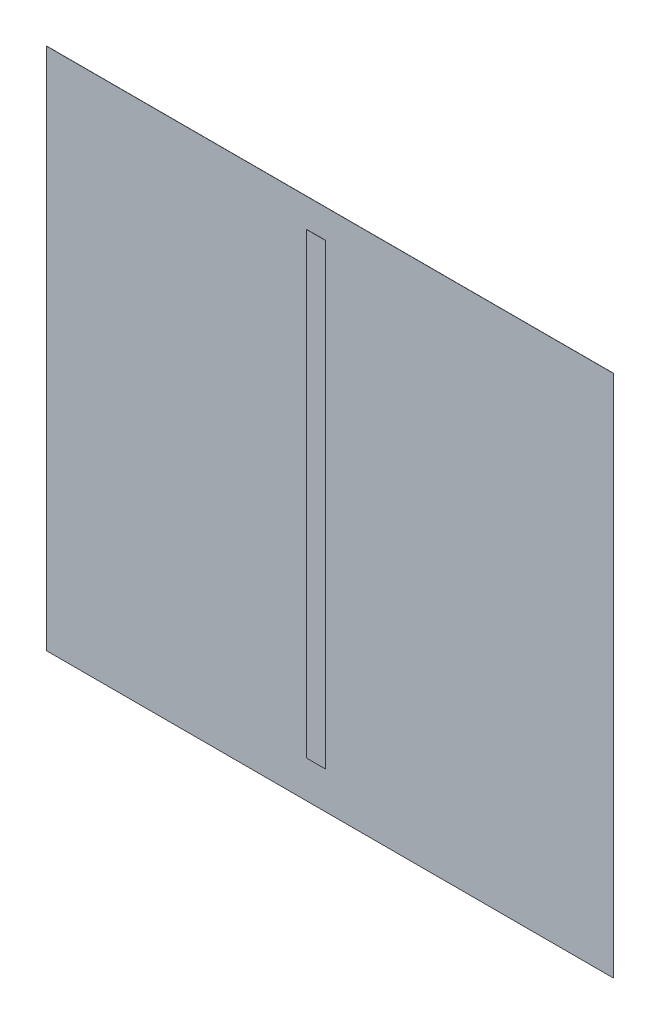
ISO-10303-21;
HEADER;
FILE_DESCRIPTION(('STEP AP214'),'2;1');
FILE_NAME('part.step','',(''),(''),'','','');
FILE_SCHEMA(('AUTOMOTIVE_DESIGN { 1 0 10303 214 1 1 1 1 }'));
ENDSEC;
DATA;
#1=APPLICATION_CONTEXT('core data for automotive mechanical design processes');
#2=APPLICATION_PROTOCOL_DEFINITION('international standard','automotive_design',2000,#1);
#3=PRODUCT_CONTEXT('',#1,'mechanical');
#4=PRODUCT('Part','Part','',(#3));
#5=PRODUCT_RELATED_PRODUCT_CATEGORY('part','',(#4));
#6=PRODUCT_DEFINITION_FORMATION('','',#4);
#7=PRODUCT_DEFINITION_CONTEXT('part definition',#1,'design');
#8=PRODUCT_DEFINITION('design','',#6,#7);
#9=PRODUCT_DEFINITION_SHAPE('','',#8);
#10=(LENGTH_UNIT() NAMED_UNIT(*) SI_UNIT(.MILLI.,.METRE.));
#11=(NAMED_UNIT(*) PLANE_ANGLE_UNIT() SI_UNIT($,.RADIAN.));
#12=(NAMED_UNIT(*) SI_UNIT($,.STERADIAN.) SOLID_ANGLE_UNIT());
#13=UNCERTAINTY_MEASURE_WITH_UNIT(LENGTH_MEASURE(1.E-05),#10,'distance_accuracy_value','');
#14=(GEOMETRIC_REPRESENTATION_CONTEXT(3) GLOBAL_UNCERTAINTY_ASSIGNED_CONTEXT((#13)) GLOBAL_UNIT_ASSIGNED_CONTEXT((#10,
#11,#12)) REPRESENTATION_CONTEXT('',''));
#15=CARTESIAN_POINT('',(0.,0.,0.));
#16=DIRECTION('',(0.,0.,1.));
#17=DIRECTION('',(1.,0.,0.));
#18=AXIS2_PLACEMENT_3D('',#15,#16,#17);
#19=CARTESIAN_POINT('',(65.9416708105409,37.7957986024811,-1.035));
#20=DIRECTION('',(-1.,0.,0.));
#21=DIRECTION('',(0.,0.,1.));
#22=AXIS2_PLACEMENT_3D('',#19,#20,#21);
#23=PLANE('',#22);
#24=DIRECTION('',(0.,-1.,0.));
#25=VECTOR('',#24,1.);
#26=CARTESIAN_POINT('',(65.9416708105409,37.7957986024811,-1.));
#27=LINE('',#26,#25);
#28=CARTESIAN_POINT('',(65.9416708105409,37.7957986024811,-1.));
#29=VERTEX_POINT('',#28);
#30=CARTESIAN_POINT('',(65.9416708105409,-76.6007630726229,-1.));
#31=VERTEX_POINT('',#30);
#32=EDGE_CURVE('E108',#29,#31,#27,.T.);
#33=ORIENTED_EDGE('',*,*,#32,.T.);
#34=DIRECTION('',(0.,0.,1.));
#35=VECTOR('',#34,1.);
#36=CARTESIAN_POINT('',(65.9416708105409,-76.6007630726229,-1.035));
#37=LINE('',#36,#35);
#38=CARTESIAN_POINT('',(65.9416708105409,-76.6007630726229,-1.035));
#39=VERTEX_POINT('',#38);
#40=EDGE_CURVE('E12',#39,#31,#37,.T.);
#41=ORIENTED_EDGE('',*,*,#40,.F.);
#42=DIRECTION('',(0.,-1.,0.));
#43=VECTOR('',#42,1.);
#44=CARTESIAN_POINT('',(65.9416708105409,37.7957986024811,-1.035));
#45=LINE('',#44,#43);
#46=CARTESIAN_POINT('',(65.9416708105409,37.7957986024811,-1.035));
#47=VERTEX_POINT('',#46);
#48=EDGE_CURVE('E96',#47,#39,#45,.T.);
#49=ORIENTED_EDGE('',*,*,#48,.F.);
#50=DIRECTION('',(0.,0.,1.));
#51=VECTOR('',#50,1.);
#52=CARTESIAN_POINT('',(65.9416708105409,37.7957986024811,-1.035));
#53=LINE('',#52,#51);
#54=EDGE_CURVE('E104',#47,#29,#53,.T.);
#55=ORIENTED_EDGE('',*,*,#54,.T.);
#56=EDGE_LOOP('',(#33,#41,#49,#55));
#57=FACE_BOUND('',#56,.T.);
#58=ADVANCED_FACE('F45',(#57),#23,.F.);
#59=CARTESIAN_POINT('',(65.9416708105409,-76.6007630726229,-1.035));
#60=DIRECTION('',(0.,1.,0.));
#61=DIRECTION('',(0.,0.,1.));
#62=AXIS2_PLACEMENT_3D('',#59,#60,#61);
#63=PLANE('',#62);
#64=DIRECTION('',(-1.,0.,0.));
#65=VECTOR('',#64,1.);
#66=CARTESIAN_POINT('',(65.9416708105409,-76.6007630726229,-1.));
#67=LINE('',#66,#65);
#68=CARTESIAN_POINT('',(-57.8796246137427,-76.6007630726229,-1.));
#69=VERTEX_POINT('',#68);
#70=EDGE_CURVE('E100',#31,#69,#67,.T.);
#71=ORIENTED_EDGE('',*,*,#70,.T.);
#72=DIRECTION('',(0.,0.,1.));
#73=VECTOR('',#72,1.);
#74=CARTESIAN_POINT('',(-57.8796246137427,-76.6007630726229,-1.035));
#75=LINE('',#74,#73);
#76=CARTESIAN_POINT('',(-57.8796246137427,-76.6007630726229,-1.035));
#77=VERTEX_POINT('',#76);
#78=EDGE_CURVE('E53',#77,#69,#75,.T.);
#79=ORIENTED_EDGE('',*,*,#78,.F.);
#80=DIRECTION('',(-1.,0.,0.));
#81=VECTOR('',#80,1.);
#82=CARTESIAN_POINT('',(65.9416708105409,-76.6007630726229,-1.035));
#83=LINE('',#82,#81);
#84=EDGE_CURVE('E91',#39,#77,#83,.T.);
#85=ORIENTED_EDGE('',*,*,#84,.F.);
#86=ORIENTED_EDGE('',*,*,#40,.T.);
#87=EDGE_LOOP('',(#71,#79,#85,#86));
#88=FACE_BOUND('',#87,.T.);
#89=ADVANCED_FACE('F99',(#88),#63,.F.);
#90=CARTESIAN_POINT('',(-57.8796246137427,37.7957986024811,-1.035));
#91=DIRECTION('',(1.,0.,0.));
#92=DIRECTION('',(0.,0.,-1.));
#93=AXIS2_PLACEMENT_3D('',#90,#91,#92);
#94=PLANE('',#93);
#95=DIRECTION('',(0.,1.,0.));
#96=VECTOR('',#95,1.);
#97=CARTESIAN_POINT('',(-57.8796246137427,37.7957986024811,-1.));
#98=LINE('',#97,#96);
#99=CARTESIAN_POINT('',(-57.8796246137427,37.7957986024811,-1.));
#100=VERTEX_POINT('',#99);
#101=EDGE_CURVE('E78',#69,#100,#98,.T.);
#102=ORIENTED_EDGE('',*,*,#101,.T.);
#103=DIRECTION('',(0.,0.,1.));
#104=VECTOR('',#103,1.);
#105=CARTESIAN_POINT('',(-57.8796246137427,37.7957986024811,-1.035));
#106=LINE('',#105,#104);
#107=CARTESIAN_POINT('',(-57.8796246137427,37.7957986024811,-1.035));
#108=VERTEX_POINT('',#107);
#109=EDGE_CURVE('E101',#108,#100,#106,.T.);
#110=ORIENTED_EDGE('',*,*,#109,.F.);
#111=DIRECTION('',(0.,1.,0.));
#112=VECTOR('',#111,1.);
#113=CARTESIAN_POINT('',(-57.8796246137427,37.7957986024811,-1.035));
#114=LINE('',#113,#112);
#115=EDGE_CURVE('E94',#77,#108,#114,.T.);
#116=ORIENTED_EDGE('',*,*,#115,.F.);
#117=ORIENTED_EDGE('',*,*,#78,.T.);
#118=EDGE_LOOP('',(#102,#110,#116,#117));
#119=FACE_BOUND('',#118,.T.);
#120=ADVANCED_FACE('F102',(#119),#94,.F.);
#121=CARTESIAN_POINT('',(65.9416708105409,37.7957986024811,-1.035));
#122=DIRECTION('',(0.,-1.,0.));
#123=DIRECTION('',(0.,0.,-1.));
#124=AXIS2_PLACEMENT_3D('',#121,#122,#123);
#125=PLANE('',#124);
#126=DIRECTION('',(1.,0.,0.));
#127=VECTOR('',#126,1.);
#128=CARTESIAN_POINT('',(65.9416708105409,37.7957986024811,-1.));
#129=LINE('',#128,#127);
#130=EDGE_CURVE('E84',#100,#29,#129,.T.);
#131=ORIENTED_EDGE('',*,*,#130,.T.);
#132=ORIENTED_EDGE('',*,*,#54,.F.);
#133=DIRECTION('',(1.,0.,0.));
#134=VECTOR('',#133,1.);
#135=CARTESIAN_POINT('',(65.9416708105409,37.7957986024811,-1.035));
#136=LINE('',#135,#134);
#137=EDGE_CURVE('E61',#108,#47,#136,.T.);
#138=ORIENTED_EDGE('',*,*,#137,.F.);
#139=ORIENTED_EDGE('',*,*,#109,.T.);
#140=EDGE_LOOP('',(#131,#132,#138,#139));
#141=FACE_BOUND('',#140,.T.);
#142=ADVANCED_FACE('F115',(#141),#125,.F.);
#143=CARTESIAN_POINT('',(0.,0.,-1.035));
#144=DIRECTION('',(0.,0.,-1.));
#145=DIRECTION('',(-1.,0.,0.));
#146=AXIS2_PLACEMENT_3D('',#143,#144,#145);
#147=PLANE('',#146);
#148=ORIENTED_EDGE('',*,*,#48,.T.);
#149=ORIENTED_EDGE('',*,*,#84,.T.);
#150=ORIENTED_EDGE('',*,*,#115,.T.);
#151=ORIENTED_EDGE('',*,*,#137,.T.);
#152=EDGE_LOOP('',(#148,#149,#150,#151));
#153=FACE_BOUND('',#152,.T.);
#154=ADVANCED_FACE('F92',(#153),#147,.T.);
#155=CARTESIAN_POINT('',(0.,0.,-1.));
#156=DIRECTION('',(0.,0.,-1.));
#157=DIRECTION('',(-1.,0.,0.));
#158=AXIS2_PLACEMENT_3D('',#155,#156,#157);
#159=PLANE('',#158);
#160=ORIENTED_EDGE('',*,*,#32,.F.);
#161=ORIENTED_EDGE('',*,*,#130,.F.);
#162=ORIENTED_EDGE('',*,*,#101,.F.);
#163=ORIENTED_EDGE('',*,*,#70,.F.);
#164=EDGE_LOOP('',(#160,#161,#162,#163));
#165=FACE_BOUND('',#164,.T.);
#166=ADVANCED_FACE('F118',(#165),#159,.F.);
#167=CLOSED_SHELL('',(#58,#89,#120,#142,#154,#166));
#168=MANIFOLD_SOLID_BREP('B2',#167);
#169=CARTESIAN_POINT('',(0.,-67.4697791059311,0.035));
#170=DIRECTION('',(0.,1.,0.));
#171=DIRECTION('',(0.,0.,1.));
#172=AXIS2_PLACEMENT_3D('',#169,#170,#171);
#173=PLANE('',#172);
#174=DIRECTION('',(1.,0.,0.));
#175=VECTOR('',#174,1.);
#176=CARTESIAN_POINT('',(0.,-67.4697791059311,0.));
#177=LINE('',#176,#175);
#178=CARTESIAN_POINT('',(0.,-67.4697791059311,0.));
#179=VERTEX_POINT('',#178);
#180=CARTESIAN_POINT('',(4.09800000000001,-67.4697791059311,0.));
#181=VERTEX_POINT('',#180);
#182=EDGE_CURVE('E232',#179,#181,#177,.T.);
#183=ORIENTED_EDGE('',*,*,#182,.T.);
#184=DIRECTION('',(0.,0.,-1.));
#185=VECTOR('',#184,1.);
#186=CARTESIAN_POINT('',(4.09800000000001,-67.4697791059311,0.035));
#187=LINE('',#186,#185);
#188=CARTESIAN_POINT('',(4.09800000000001,-67.4697791059311,0.035));
#189=VERTEX_POINT('',#188);
#190=EDGE_CURVE('E43',#189,#181,#187,.T.);
#191=ORIENTED_EDGE('',*,*,#190,.F.);
#192=DIRECTION('',(1.,0.,0.));
#193=VECTOR('',#192,1.);
#194=CARTESIAN_POINT('',(0.,-67.4697791059311,0.035));
#195=LINE('',#194,#193);
#196=CARTESIAN_POINT('',(0.,-67.4697791059311,0.035));
#197=VERTEX_POINT('',#196);
#198=EDGE_CURVE('E220',#197,#189,#195,.T.);
#199=ORIENTED_EDGE('',*,*,#198,.F.);
#200=DIRECTION('',(0.,0.,-1.));
#201=VECTOR('',#200,1.);
#202=CARTESIAN_POINT('',(0.,-67.4697791059311,0.035));
#203=LINE('',#202,#201);
#204=EDGE_CURVE('E228',#197,#179,#203,.T.);
#205=ORIENTED_EDGE('',*,*,#204,.T.);
#206=EDGE_LOOP('',(#183,#191,#199,#205));
#207=FACE_BOUND('',#206,.T.);
#208=ADVANCED_FACE('F169',(#207),#173,.F.);
#209=CARTESIAN_POINT('',(4.09800000000001,-67.4697791059311,0.035));
#210=DIRECTION('',(-1.,0.,0.));
#211=DIRECTION('',(0.,0.,1.));
#212=AXIS2_PLACEMENT_3D('',#209,#210,#211);
#213=PLANE('',#212);
#214=DIRECTION('',(0.,1.,0.));
#215=VECTOR('',#214,1.);
#216=CARTESIAN_POINT('',(4.09800000000001,-67.4697791059311,0.));
#217=LINE('',#216,#215);
#218=CARTESIAN_POINT('',(4.09800000000001,32.5302208940689,0.));
#219=VERTEX_POINT('',#218);
#220=EDGE_CURVE('E224',#181,#219,#217,.T.);
#221=ORIENTED_EDGE('',*,*,#220,.T.);
#222=DIRECTION('',(0.,0.,-1.));
#223=VECTOR('',#222,1.);
#224=CARTESIAN_POINT('',(4.09800000000001,32.5302208940689,0.035));
#225=LINE('',#224,#223);
#226=CARTESIAN_POINT('',(4.09800000000001,32.5302208940689,0.035));
#227=VERTEX_POINT('',#226);
#228=EDGE_CURVE('E177',#227,#219,#225,.T.);
#229=ORIENTED_EDGE('',*,*,#228,.F.);
#230=DIRECTION('',(0.,1.,0.));
#231=VECTOR('',#230,1.);
#232=CARTESIAN_POINT('',(4.09800000000001,-67.4697791059311,0.035));
#233=LINE('',#232,#231);
#234=EDGE_CURVE('E215',#189,#227,#233,.T.);
#235=ORIENTED_EDGE('',*,*,#234,.F.);
#236=ORIENTED_EDGE('',*,*,#190,.T.);
#237=EDGE_LOOP('',(#221,#229,#235,#236));
#238=FACE_BOUND('',#237,.T.);
#239=ADVANCED_FACE('F223',(#238),#213,.F.);
#240=CARTESIAN_POINT('',(4.09800000000001,32.5302208940689,0.035));
#241=DIRECTION('',(0.,-1.,0.));
#242=DIRECTION('',(0.,0.,-1.));
#243=AXIS2_PLACEMENT_3D('',#240,#241,#242);
#244=PLANE('',#243);
#245=DIRECTION('',(-1.,0.,0.));
#246=VECTOR('',#245,1.);
#247=CARTESIAN_POINT('',(4.09800000000001,32.5302208940689,0.));
#248=LINE('',#247,#246);
#249=CARTESIAN_POINT('',(0.,32.5302208940689,0.));
#250=VERTEX_POINT('',#249);
#251=EDGE_CURVE('E202',#219,#250,#248,.T.);
#252=ORIENTED_EDGE('',*,*,#251,.T.);
#253=DIRECTION('',(0.,0.,-1.));
#254=VECTOR('',#253,1.);
#255=CARTESIAN_POINT('',(0.,32.5302208940689,0.035));
#256=LINE('',#255,#254);
#257=CARTESIAN_POINT('',(0.,32.5302208940689,0.035));
#258=VERTEX_POINT('',#257);
#259=EDGE_CURVE('E225',#258,#250,#256,.T.);
#260=ORIENTED_EDGE('',*,*,#259,.F.);
#261=DIRECTION('',(-1.,0.,0.));
#262=VECTOR('',#261,1.);
#263=CARTESIAN_POINT('',(4.09800000000001,32.5302208940689,0.035));
#264=LINE('',#263,#262);
#265=EDGE_CURVE('E218',#227,#258,#264,.T.);
#266=ORIENTED_EDGE('',*,*,#265,.F.);
#267=ORIENTED_EDGE('',*,*,#228,.T.);
#268=EDGE_LOOP('',(#252,#260,#266,#267));
#269=FACE_BOUND('',#268,.T.);
#270=ADVANCED_FACE('F226',(#269),#244,.F.);
#271=CARTESIAN_POINT('',(0.,32.5302208940689,0.035));
#272=DIRECTION('',(1.,0.,0.));
#273=DIRECTION('',(0.,1.,0.));
#274=AXIS2_PLACEMENT_3D('',#271,#272,#273);
#275=PLANE('',#274);
#276=DIRECTION('',(0.,-1.,0.));
#277=VECTOR('',#276,1.);
#278=CARTESIAN_POINT('',(0.,32.5302208940689,0.));
#279=LINE('',#278,#277);
#280=EDGE_CURVE('E208',#250,#179,#279,.T.);
#281=ORIENTED_EDGE('',*,*,#280,.T.);
#282=ORIENTED_EDGE('',*,*,#204,.F.);
#283=DIRECTION('',(0.,-1.,0.));
#284=VECTOR('',#283,1.);
#285=CARTESIAN_POINT('',(0.,32.5302208940689,0.035));
#286=LINE('',#285,#284);
#287=EDGE_CURVE('E185',#258,#197,#286,.T.);
#288=ORIENTED_EDGE('',*,*,#287,.F.);
#289=ORIENTED_EDGE('',*,*,#259,.T.);
#290=EDGE_LOOP('',(#281,#282,#288,#289));
#291=FACE_BOUND('',#290,.T.);
#292=ADVANCED_FACE('F239',(#291),#275,.F.);
#293=CARTESIAN_POINT('',(0.,0.,0.035));
#294=DIRECTION('',(0.,0.,1.));
#295=DIRECTION('',(1.,0.,0.));
#296=AXIS2_PLACEMENT_3D('',#293,#294,#295);
#297=PLANE('',#296);
#298=ORIENTED_EDGE('',*,*,#198,.T.);
#299=ORIENTED_EDGE('',*,*,#234,.T.);
#300=ORIENTED_EDGE('',*,*,#265,.T.);
#301=ORIENTED_EDGE('',*,*,#287,.T.);
#302=EDGE_LOOP('',(#298,#299,#300,#301));
#303=FACE_BOUND('',#302,.T.);
#304=ADVANCED_FACE('F216',(#303),#297,.T.);
#305=CARTESIAN_POINT('',(0.,0.,0.));
#306=DIRECTION('',(0.,0.,1.));
#307=DIRECTION('',(1.,0.,0.));
#308=AXIS2_PLACEMENT_3D('',#305,#306,#307);
#309=PLANE('',#308);
#310=ORIENTED_EDGE('',*,*,#182,.F.);
#311=ORIENTED_EDGE('',*,*,#280,.F.);
#312=ORIENTED_EDGE('',*,*,#251,.F.);
#313=ORIENTED_EDGE('',*,*,#220,.F.);
#314=EDGE_LOOP('',(#310,#311,#312,#313));
#315=FACE_BOUND('',#314,.T.);
#316=ADVANCED_FACE('F242',(#315),#309,.F.);
#317=CLOSED_SHELL('',(#208,#239,#270,#292,#304,#316));
#318=MANIFOLD_SOLID_BREP('B6',#317);
#319=ADVANCED_BREP_SHAPE_REPRESENTATION('',(#18,#168,#318),#14);
#320=SHAPE_DEFINITION_REPRESENTATION(#9,#319);
ENDSEC;
END-ISO-10303-21;
